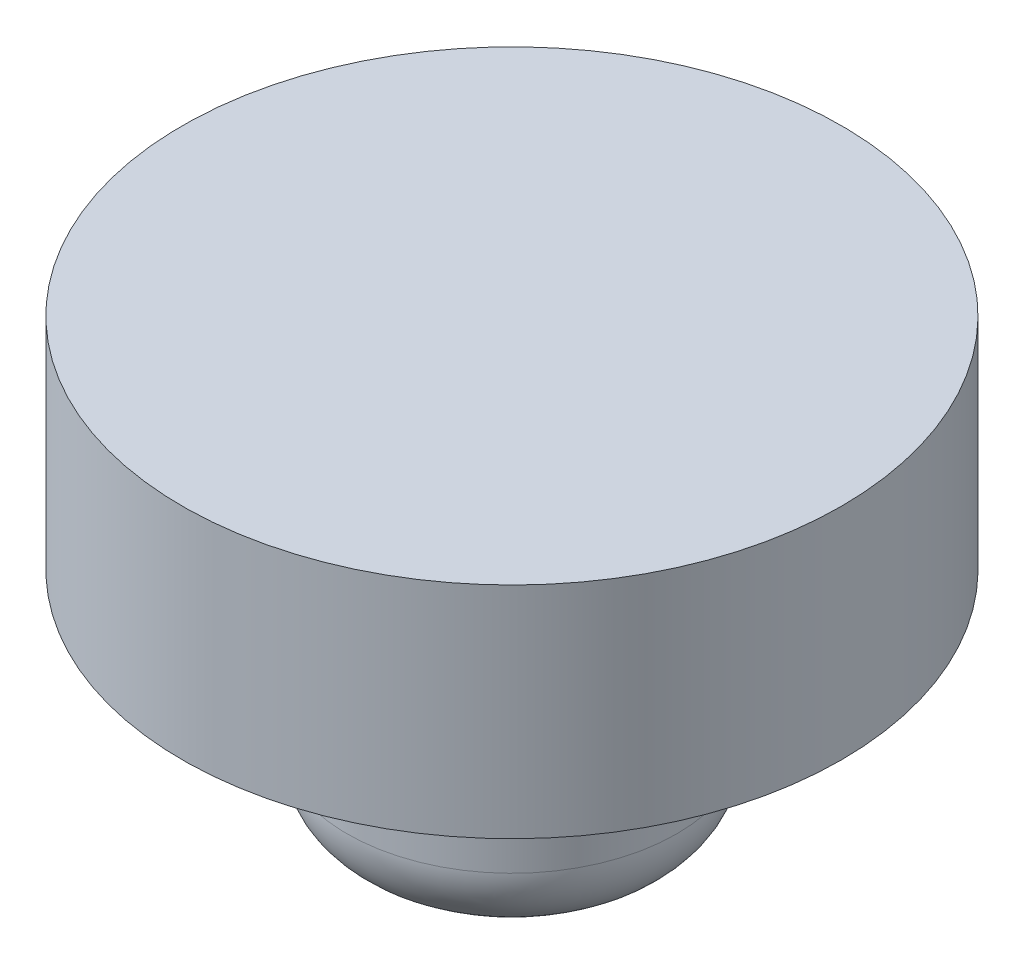
ISO-10303-21;
HEADER;
FILE_DESCRIPTION(('STEP AP214'),'2;1');
FILE_NAME('part.step','',(''),(''),'','','');
FILE_SCHEMA(('AUTOMOTIVE_DESIGN { 1 0 10303 214 1 1 1 1 }'));
ENDSEC;
DATA;
#1=APPLICATION_CONTEXT('core data for automotive mechanical design processes');
#2=APPLICATION_PROTOCOL_DEFINITION('international standard','automotive_design',2000,#1);
#3=PRODUCT_CONTEXT('',#1,'mechanical');
#4=PRODUCT('Part','Part','',(#3));
#5=PRODUCT_RELATED_PRODUCT_CATEGORY('part','',(#4));
#6=PRODUCT_DEFINITION_FORMATION('','',#4);
#7=PRODUCT_DEFINITION_CONTEXT('part definition',#1,'design');
#8=PRODUCT_DEFINITION('design','',#6,#7);
#9=PRODUCT_DEFINITION_SHAPE('','',#8);
#10=(LENGTH_UNIT() NAMED_UNIT(*) SI_UNIT(.MILLI.,.METRE.));
#11=(NAMED_UNIT(*) PLANE_ANGLE_UNIT() SI_UNIT($,.RADIAN.));
#12=(NAMED_UNIT(*) SI_UNIT($,.STERADIAN.) SOLID_ANGLE_UNIT());
#13=UNCERTAINTY_MEASURE_WITH_UNIT(LENGTH_MEASURE(1.E-05),#10,'distance_accuracy_value','');
#14=(GEOMETRIC_REPRESENTATION_CONTEXT(3) GLOBAL_UNCERTAINTY_ASSIGNED_CONTEXT((#13)) GLOBAL_UNIT_ASSIGNED_CONTEXT((#10,
#11,#12)) REPRESENTATION_CONTEXT('',''));
#15=CARTESIAN_POINT('',(0.,0.,0.));
#16=DIRECTION('',(0.,0.,1.));
#17=DIRECTION('',(1.,0.,0.));
#18=AXIS2_PLACEMENT_3D('',#15,#16,#17);
#19=CARTESIAN_POINT('',(70.,-300.,999.189515242654));
#20=DIRECTION('',(0.,-1.,0.));
#21=DIRECTION('',(1.,0.,0.));
#22=AXIS2_PLACEMENT_3D('',#19,#20,#21);
#23=PLANE('',#22);
#24=CARTESIAN_POINT('',(70.,-300.,999.189515242654));
#25=DIRECTION('',(0.,-1.,0.));
#26=DIRECTION('',(1.,0.,0.));
#27=AXIS2_PLACEMENT_3D('',#24,#25,#26);
#28=CIRCLE('',#27,45.);
#29=CARTESIAN_POINT('',(115.,-300.,999.189515242654));
#30=VERTEX_POINT('',#29);
#31=EDGE_CURVE('E42',#30,#30,#28,.T.);
#32=ORIENTED_EDGE('',*,*,#31,.T.);
#33=EDGE_LOOP('',(#32));
#34=FACE_BOUND('',#33,.T.);
#35=CARTESIAN_POINT('',(70.,-300.,999.189515242654));
#36=DIRECTION('',(0.,-1.,0.));
#37=DIRECTION('',(1.,0.,0.));
#38=AXIS2_PLACEMENT_3D('',#35,#36,#37);
#39=CIRCLE('',#38,22.5);
#40=CARTESIAN_POINT('',(92.5,-300.,999.189515242654));
#41=VERTEX_POINT('',#40);
#42=EDGE_CURVE('E50',#41,#41,#39,.T.);
#43=ORIENTED_EDGE('',*,*,#42,.F.);
#44=EDGE_LOOP('',(#43));
#45=FACE_BOUND('',#44,.T.);
#46=ADVANCED_FACE('F31',(#34,#45),#23,.T.);
#47=CARTESIAN_POINT('',(70.,-270.,999.189515242654));
#48=DIRECTION('',(0.,-1.,0.));
#49=DIRECTION('',(1.,0.,0.));
#50=AXIS2_PLACEMENT_3D('',#47,#48,#49);
#51=PLANE('',#50);
#52=CARTESIAN_POINT('',(70.,-270.,999.189515242654));
#53=DIRECTION('',(0.,-1.,0.));
#54=DIRECTION('',(1.,0.,0.));
#55=AXIS2_PLACEMENT_3D('',#52,#53,#54);
#56=CIRCLE('',#55,45.);
#57=CARTESIAN_POINT('',(115.,-270.,999.189515242654));
#58=VERTEX_POINT('',#57);
#59=EDGE_CURVE('E46',#58,#58,#56,.T.);
#60=ORIENTED_EDGE('',*,*,#59,.F.);
#61=EDGE_LOOP('',(#60));
#62=FACE_BOUND('',#61,.T.);
#63=ADVANCED_FACE('F58',(#62),#51,.F.);
#64=CARTESIAN_POINT('',(70.,-300.,999.189515242654));
#65=DIRECTION('',(0.,1.,0.));
#66=DIRECTION('',(-1.,0.,0.));
#67=AXIS2_PLACEMENT_3D('',#64,#65,#66);
#68=CYLINDRICAL_SURFACE('',#67,45.);
#69=ORIENTED_EDGE('',*,*,#31,.F.);
#70=EDGE_LOOP('',(#69));
#71=FACE_BOUND('',#70,.T.);
#72=ORIENTED_EDGE('',*,*,#59,.T.);
#73=EDGE_LOOP('',(#72));
#74=FACE_BOUND('',#73,.T.);
#75=ADVANCED_FACE('F64',(#71,#74),#68,.T.);
#76=CARTESIAN_POINT('',(70.,-330.,999.189515242654));
#77=DIRECTION('',(0.,1.,0.));
#78=DIRECTION('',(-1.,0.,0.));
#79=AXIS2_PLACEMENT_3D('',#76,#77,#78);
#80=CYLINDRICAL_SURFACE('',#79,22.5);
#81=CARTESIAN_POINT('',(70.,-320.,999.189515242654));
#82=DIRECTION('',(0.,-1.,0.));
#83=DIRECTION('',(1.,0.,0.));
#84=AXIS2_PLACEMENT_3D('',#81,#82,#83);
#85=CIRCLE('',#84,22.5);
#86=CARTESIAN_POINT('',(92.5000000000001,-320.,999.189515242654));
#87=VERTEX_POINT('',#86);
#88=EDGE_CURVE('E10',#87,#87,#85,.F.);
#89=ORIENTED_EDGE('',*,*,#88,.T.);
#90=EDGE_LOOP('',(#89));
#91=FACE_BOUND('',#90,.T.);
#92=ORIENTED_EDGE('',*,*,#42,.T.);
#93=EDGE_LOOP('',(#92));
#94=FACE_BOUND('',#93,.T.);
#95=ADVANCED_FACE('F55',(#91,#94),#80,.T.);
#96=CARTESIAN_POINT('',(70.,-330.,999.189515242654));
#97=DIRECTION('',(0.,-1.,0.));
#98=DIRECTION('',(1.,0.,0.));
#99=AXIS2_PLACEMENT_3D('',#96,#97,#98);
#100=PLANE('',#99);
#101=CARTESIAN_POINT('',(70.,-330.,999.189515242654));
#102=DIRECTION('',(0.,-1.,0.));
#103=DIRECTION('',(1.,0.,0.));
#104=AXIS2_PLACEMENT_3D('',#101,#102,#103);
#105=CIRCLE('',#104,12.5);
#106=CARTESIAN_POINT('',(82.5000000000001,-330.,999.189515242654));
#107=VERTEX_POINT('',#106);
#108=EDGE_CURVE('E38',#107,#107,#105,.T.);
#109=ORIENTED_EDGE('',*,*,#108,.T.);
#110=EDGE_LOOP('',(#109));
#111=FACE_BOUND('',#110,.T.);
#112=ADVANCED_FACE('F74',(#111),#100,.T.);
#113=CARTESIAN_POINT('',(70.,-320.,999.189515242654));
#114=DIRECTION('',(0.,-1.,0.));
#115=DIRECTION('',(1.,0.,0.));
#116=AXIS2_PLACEMENT_3D('',#113,#114,#115);
#117=TOROIDAL_SURFACE('',#116,12.5,10.);
#118=ORIENTED_EDGE('',*,*,#88,.F.);
#119=EDGE_LOOP('',(#118));
#120=FACE_BOUND('',#119,.T.);
#121=ORIENTED_EDGE('',*,*,#108,.F.);
#122=EDGE_LOOP('',(#121));
#123=FACE_BOUND('',#122,.T.);
#124=ADVANCED_FACE('F33',(#120,#123),#117,.T.);
#125=CLOSED_SHELL('',(#46,#63,#75,#95,#112,#124));
#126=MANIFOLD_SOLID_BREP('B2',#125);
#127=ADVANCED_BREP_SHAPE_REPRESENTATION('',(#18,#126),#14);
#128=SHAPE_DEFINITION_REPRESENTATION(#9,#127);
ENDSEC;
END-ISO-10303-21;
